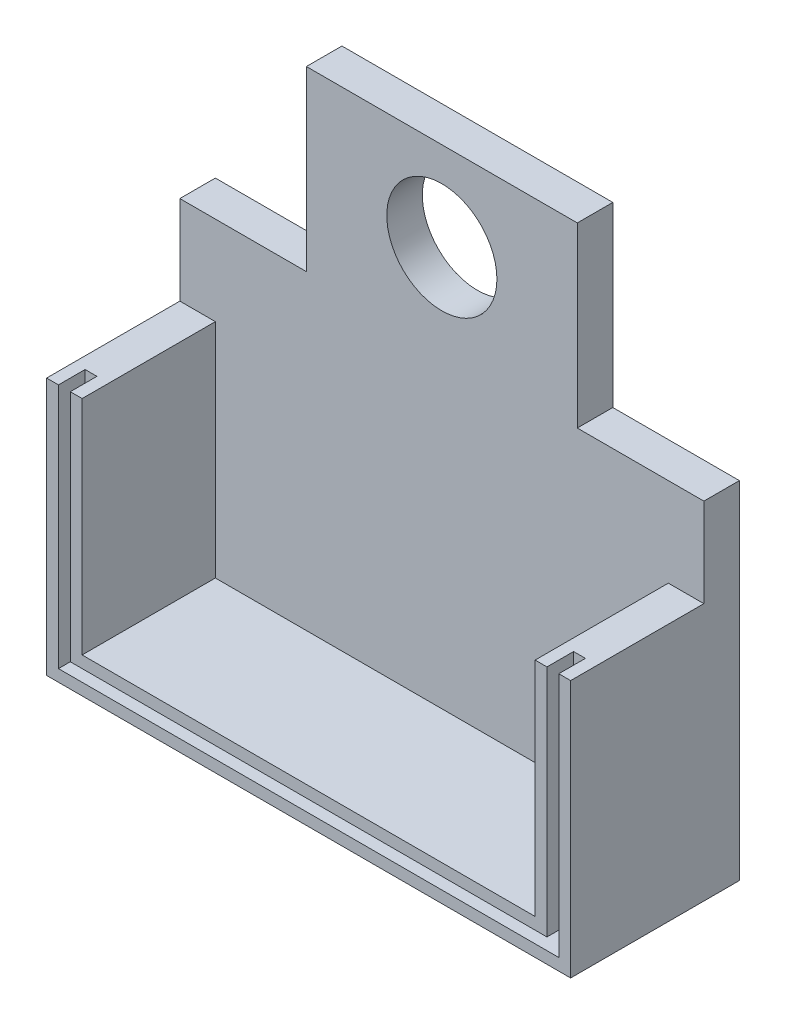
ISO-10303-21;
HEADER;
FILE_DESCRIPTION(('STEP AP214'),'2;1');
FILE_NAME('part.step','',(''),(''),'','','');
FILE_SCHEMA(('AUTOMOTIVE_DESIGN { 1 0 10303 214 1 1 1 1 }'));
ENDSEC;
DATA;
#1=APPLICATION_CONTEXT('core data for automotive mechanical design processes');
#2=APPLICATION_PROTOCOL_DEFINITION('international standard','automotive_design',2000,#1);
#3=PRODUCT_CONTEXT('',#1,'mechanical');
#4=PRODUCT('Part','Part','',(#3));
#5=PRODUCT_RELATED_PRODUCT_CATEGORY('part','',(#4));
#6=PRODUCT_DEFINITION_FORMATION('','',#4);
#7=PRODUCT_DEFINITION_CONTEXT('part definition',#1,'design');
#8=PRODUCT_DEFINITION('design','',#6,#7);
#9=PRODUCT_DEFINITION_SHAPE('','',#8);
#10=(LENGTH_UNIT() NAMED_UNIT(*) SI_UNIT(.MILLI.,.METRE.));
#11=(NAMED_UNIT(*) PLANE_ANGLE_UNIT() SI_UNIT($,.RADIAN.));
#12=(NAMED_UNIT(*) SI_UNIT($,.STERADIAN.) SOLID_ANGLE_UNIT());
#13=UNCERTAINTY_MEASURE_WITH_UNIT(LENGTH_MEASURE(1.E-05),#10,'distance_accuracy_value','');
#14=(GEOMETRIC_REPRESENTATION_CONTEXT(3) GLOBAL_UNCERTAINTY_ASSIGNED_CONTEXT((#13)) GLOBAL_UNIT_ASSIGNED_CONTEXT((#10,
#11,#12)) REPRESENTATION_CONTEXT('',''));
#15=CARTESIAN_POINT('',(0.,0.,0.));
#16=DIRECTION('',(0.,0.,1.));
#17=DIRECTION('',(1.,0.,0.));
#18=AXIS2_PLACEMENT_3D('',#15,#16,#17);
#19=CARTESIAN_POINT('',(0.,-20.,19.));
#20=DIRECTION('',(0.,-1.,0.));
#21=DIRECTION('',(0.,0.,-1.));
#22=AXIS2_PLACEMENT_3D('',#19,#20,#21);
#23=PLANE('',#22);
#24=DIRECTION('',(0.,0.,1.));
#25=VECTOR('',#24,1.);
#26=CARTESIAN_POINT('',(26.8333333333333,-20.,16.));
#27=LINE('',#26,#25);
#28=CARTESIAN_POINT('',(26.8333333333333,-20.,16.));
#29=VERTEX_POINT('',#28);
#30=CARTESIAN_POINT('',(26.8333333333333,-20.,19.));
#31=VERTEX_POINT('',#30);
#32=EDGE_CURVE('E270',#29,#31,#27,.T.);
#33=ORIENTED_EDGE('',*,*,#32,.F.);
#34=DIRECTION('',(-1.,0.,0.));
#35=VECTOR('',#34,1.);
#36=CARTESIAN_POINT('',(0.,-20.,16.));
#37=LINE('',#36,#35);
#38=CARTESIAN_POINT('',(28.1666666666667,-20.,16.));
#39=VERTEX_POINT('',#38);
#40=EDGE_CURVE('E235',#39,#29,#37,.T.);
#41=ORIENTED_EDGE('',*,*,#40,.F.);
#42=DIRECTION('',(0.,0.,1.));
#43=VECTOR('',#42,1.);
#44=CARTESIAN_POINT('',(28.1666666666667,-20.,16.));
#45=LINE('',#44,#43);
#46=CARTESIAN_POINT('',(28.1666666666667,-20.,19.));
#47=VERTEX_POINT('',#46);
#48=EDGE_CURVE('E273',#39,#47,#45,.T.);
#49=ORIENTED_EDGE('',*,*,#48,.T.);
#50=DIRECTION('',(-1.,0.,0.));
#51=VECTOR('',#50,1.);
#52=CARTESIAN_POINT('',(0.,-20.,19.));
#53=LINE('',#52,#51);
#54=CARTESIAN_POINT('',(29.5,-20.,19.));
#55=VERTEX_POINT('',#54);
#56=EDGE_CURVE('E297',#55,#47,#53,.T.);
#57=ORIENTED_EDGE('',*,*,#56,.F.);
#58=DIRECTION('',(0.,0.,-1.));
#59=VECTOR('',#58,1.);
#60=CARTESIAN_POINT('',(29.5,-20.,19.));
#61=LINE('',#60,#59);
#62=CARTESIAN_POINT('',(29.5,-20.,4.));
#63=VERTEX_POINT('',#62);
#64=EDGE_CURVE('E351',#55,#63,#61,.T.);
#65=ORIENTED_EDGE('',*,*,#64,.T.);
#66=DIRECTION('',(-1.,0.,0.));
#67=VECTOR('',#66,1.);
#68=CARTESIAN_POINT('',(0.,-20.,4.));
#69=LINE('',#68,#67);
#70=CARTESIAN_POINT('',(25.5,-20.,4.));
#71=VERTEX_POINT('',#70);
#72=EDGE_CURVE('E266',#63,#71,#69,.T.);
#73=ORIENTED_EDGE('',*,*,#72,.T.);
#74=DIRECTION('',(0.,0.,-1.));
#75=VECTOR('',#74,1.);
#76=CARTESIAN_POINT('',(25.5,-20.,19.));
#77=LINE('',#76,#75);
#78=CARTESIAN_POINT('',(25.5,-20.,19.));
#79=VERTEX_POINT('',#78);
#80=EDGE_CURVE('E347',#79,#71,#77,.T.);
#81=ORIENTED_EDGE('',*,*,#80,.F.);
#82=EDGE_CURVE('E296',#31,#79,#53,.T.);
#83=ORIENTED_EDGE('',*,*,#82,.F.);
#84=EDGE_LOOP('',(#33,#41,#49,#57,#65,#73,#81,#83));
#85=FACE_BOUND('',#84,.T.);
#86=ADVANCED_FACE('F45',(#85),#23,.F.);
#87=CARTESIAN_POINT('',(0.,-20.,19.));
#88=DIRECTION('',(0.,1.,0.));
#89=DIRECTION('',(0.,0.,1.));
#90=AXIS2_PLACEMENT_3D('',#87,#88,#89);
#91=PLANE('',#90);
#92=DIRECTION('',(-1.,0.,0.));
#93=VECTOR('',#92,1.);
#94=CARTESIAN_POINT('',(0.,-20.,16.));
#95=LINE('',#94,#93);
#96=CARTESIAN_POINT('',(-26.8333333333333,-20.,16.));
#97=VERTEX_POINT('',#96);
#98=CARTESIAN_POINT('',(-28.1666666666667,-20.,16.));
#99=VERTEX_POINT('',#98);
#100=EDGE_CURVE('E214',#97,#99,#95,.T.);
#101=ORIENTED_EDGE('',*,*,#100,.F.);
#102=DIRECTION('',(0.,0.,1.));
#103=VECTOR('',#102,1.);
#104=CARTESIAN_POINT('',(-26.8333333333333,-20.,16.));
#105=LINE('',#104,#103);
#106=CARTESIAN_POINT('',(-26.8333333333333,-20.,19.));
#107=VERTEX_POINT('',#106);
#108=EDGE_CURVE('E196',#97,#107,#105,.T.);
#109=ORIENTED_EDGE('',*,*,#108,.T.);
#110=DIRECTION('',(1.,0.,0.));
#111=VECTOR('',#110,1.);
#112=CARTESIAN_POINT('',(0.,-20.,19.));
#113=LINE('',#112,#111);
#114=CARTESIAN_POINT('',(-25.5,-20.,19.));
#115=VERTEX_POINT('',#114);
#116=EDGE_CURVE('E313',#107,#115,#113,.T.);
#117=ORIENTED_EDGE('',*,*,#116,.T.);
#118=DIRECTION('',(0.,0.,-1.));
#119=VECTOR('',#118,1.);
#120=CARTESIAN_POINT('',(-25.5,-20.,19.));
#121=LINE('',#120,#119);
#122=CARTESIAN_POINT('',(-25.5,-20.,4.));
#123=VERTEX_POINT('',#122);
#124=EDGE_CURVE('E336',#115,#123,#121,.T.);
#125=ORIENTED_EDGE('',*,*,#124,.T.);
#126=DIRECTION('',(1.,0.,0.));
#127=VECTOR('',#126,1.);
#128=CARTESIAN_POINT('',(0.,-20.,4.));
#129=LINE('',#128,#127);
#130=CARTESIAN_POINT('',(-29.5,-20.,4.));
#131=VERTEX_POINT('',#130);
#132=EDGE_CURVE('E69',#131,#123,#129,.T.);
#133=ORIENTED_EDGE('',*,*,#132,.F.);
#134=DIRECTION('',(0.,0.,-1.));
#135=VECTOR('',#134,1.);
#136=CARTESIAN_POINT('',(-29.5,-20.,19.));
#137=LINE('',#136,#135);
#138=CARTESIAN_POINT('',(-29.5,-20.,19.));
#139=VERTEX_POINT('',#138);
#140=EDGE_CURVE('E317',#139,#131,#137,.T.);
#141=ORIENTED_EDGE('',*,*,#140,.F.);
#142=CARTESIAN_POINT('',(-28.1666666666667,-20.,19.));
#143=VERTEX_POINT('',#142);
#144=EDGE_CURVE('E314',#139,#143,#113,.T.);
#145=ORIENTED_EDGE('',*,*,#144,.T.);
#146=DIRECTION('',(0.,0.,1.));
#147=VECTOR('',#146,1.);
#148=CARTESIAN_POINT('',(-28.1666666666667,-20.,16.));
#149=LINE('',#148,#147);
#150=EDGE_CURVE('E61',#99,#143,#149,.T.);
#151=ORIENTED_EDGE('',*,*,#150,.F.);
#152=EDGE_LOOP('',(#101,#109,#117,#125,#133,#141,#145,#151));
#153=FACE_BOUND('',#152,.T.);
#154=ADVANCED_FACE('F219',(#153),#91,.T.);
#155=CARTESIAN_POINT('',(0.,0.,19.));
#156=DIRECTION('',(0.,0.,1.));
#157=DIRECTION('',(1.,0.,0.));
#158=AXIS2_PLACEMENT_3D('',#155,#156,#157);
#159=PLANE('',#158);
#160=ORIENTED_EDGE('',*,*,#116,.F.);
#161=DIRECTION('',(0.,-1.,0.));
#162=VECTOR('',#161,1.);
#163=CARTESIAN_POINT('',(-26.8333333333333,0.,19.));
#164=LINE('',#163,#162);
#165=CARTESIAN_POINT('',(-26.8333333333333,-46.3333333333333,19.));
#166=VERTEX_POINT('',#165);
#167=EDGE_CURVE('E203',#107,#166,#164,.T.);
#168=ORIENTED_EDGE('',*,*,#167,.T.);
#169=DIRECTION('',(1.,0.,0.));
#170=VECTOR('',#169,1.);
#171=CARTESIAN_POINT('',(0.,-46.3333333333333,19.));
#172=LINE('',#171,#170);
#173=CARTESIAN_POINT('',(26.8333333333333,-46.3333333333333,19.));
#174=VERTEX_POINT('',#173);
#175=EDGE_CURVE('E217',#166,#174,#172,.T.);
#176=ORIENTED_EDGE('',*,*,#175,.T.);
#177=DIRECTION('',(0.,1.,0.));
#178=VECTOR('',#177,1.);
#179=CARTESIAN_POINT('',(26.8333333333333,0.,19.));
#180=LINE('',#179,#178);
#181=EDGE_CURVE('E256',#174,#31,#180,.T.);
#182=ORIENTED_EDGE('',*,*,#181,.T.);
#183=ORIENTED_EDGE('',*,*,#82,.T.);
#184=DIRECTION('',(0.,1.,0.));
#185=VECTOR('',#184,1.);
#186=CARTESIAN_POINT('',(25.5,0.,19.));
#187=LINE('',#186,#185);
#188=CARTESIAN_POINT('',(25.5,-45.,19.));
#189=VERTEX_POINT('',#188);
#190=EDGE_CURVE('E301',#189,#79,#187,.T.);
#191=ORIENTED_EDGE('',*,*,#190,.F.);
#192=DIRECTION('',(1.,0.,0.));
#193=VECTOR('',#192,1.);
#194=CARTESIAN_POINT('',(0.,-45.,19.));
#195=LINE('',#194,#193);
#196=CARTESIAN_POINT('',(-25.5,-45.,19.));
#197=VERTEX_POINT('',#196);
#198=EDGE_CURVE('E305',#197,#189,#195,.T.);
#199=ORIENTED_EDGE('',*,*,#198,.F.);
#200=DIRECTION('',(0.,1.,0.));
#201=VECTOR('',#200,1.);
#202=CARTESIAN_POINT('',(-25.5,0.,19.));
#203=LINE('',#202,#201);
#204=EDGE_CURVE('E309',#197,#115,#203,.T.);
#205=ORIENTED_EDGE('',*,*,#204,.T.);
#206=EDGE_LOOP('',(#160,#168,#176,#182,#183,#191,#199,#205));
#207=FACE_BOUND('',#206,.T.);
#208=ADVANCED_FACE('F458',(#207),#159,.T.);
#209=CARTESIAN_POINT('',(0.,0.,4.));
#210=DIRECTION('',(0.,0.,-1.));
#211=DIRECTION('',(-1.,0.,0.));
#212=AXIS2_PLACEMENT_3D('',#209,#210,#211);
#213=PLANE('',#212);
#214=DIRECTION('',(0.,1.,0.));
#215=VECTOR('',#214,1.);
#216=CARTESIAN_POINT('',(-29.5,-45.,4.));
#217=LINE('',#216,#215);
#218=CARTESIAN_POINT('',(-29.5,-10.,4.));
#219=VERTEX_POINT('',#218);
#220=EDGE_CURVE('E391',#131,#219,#217,.T.);
#221=ORIENTED_EDGE('',*,*,#220,.F.);
#222=ORIENTED_EDGE('',*,*,#132,.T.);
#223=DIRECTION('',(0.,1.,0.));
#224=VECTOR('',#223,1.);
#225=CARTESIAN_POINT('',(-25.5,0.,4.));
#226=LINE('',#225,#224);
#227=CARTESIAN_POINT('',(-25.5,-45.,4.));
#228=VERTEX_POINT('',#227);
#229=EDGE_CURVE('E327',#228,#123,#226,.T.);
#230=ORIENTED_EDGE('',*,*,#229,.F.);
#231=DIRECTION('',(1.,0.,0.));
#232=VECTOR('',#231,1.);
#233=CARTESIAN_POINT('',(0.,-45.,4.));
#234=LINE('',#233,#232);
#235=CARTESIAN_POINT('',(25.5,-45.,4.));
#236=VERTEX_POINT('',#235);
#237=EDGE_CURVE('E324',#228,#236,#234,.T.);
#238=ORIENTED_EDGE('',*,*,#237,.T.);
#239=DIRECTION('',(0.,1.,0.));
#240=VECTOR('',#239,1.);
#241=CARTESIAN_POINT('',(25.5,0.,4.));
#242=LINE('',#241,#240);
#243=EDGE_CURVE('E321',#236,#71,#242,.T.);
#244=ORIENTED_EDGE('',*,*,#243,.T.);
#245=ORIENTED_EDGE('',*,*,#72,.F.);
#246=DIRECTION('',(0.,1.,0.));
#247=VECTOR('',#246,1.);
#248=CARTESIAN_POINT('',(29.5,-45.,4.));
#249=LINE('',#248,#247);
#250=CARTESIAN_POINT('',(29.5,-10.,4.));
#251=VERTEX_POINT('',#250);
#252=EDGE_CURVE('E394',#63,#251,#249,.T.);
#253=ORIENTED_EDGE('',*,*,#252,.T.);
#254=DIRECTION('',(-1.,0.,0.));
#255=VECTOR('',#254,1.);
#256=CARTESIAN_POINT('',(-29.5,-10.,4.));
#257=LINE('',#256,#255);
#258=CARTESIAN_POINT('',(15.25,-10.,4.));
#259=VERTEX_POINT('',#258);
#260=EDGE_CURVE('E371',#251,#259,#257,.T.);
#261=ORIENTED_EDGE('',*,*,#260,.T.);
#262=DIRECTION('',(0.,1.,0.));
#263=VECTOR('',#262,1.);
#264=CARTESIAN_POINT('',(15.25,-10.,4.));
#265=LINE('',#264,#263);
#266=CARTESIAN_POINT('',(15.25,10.,4.));
#267=VERTEX_POINT('',#266);
#268=EDGE_CURVE('E406',#259,#267,#265,.T.);
#269=ORIENTED_EDGE('',*,*,#268,.T.);
#270=DIRECTION('',(-1.,0.,0.));
#271=VECTOR('',#270,1.);
#272=CARTESIAN_POINT('',(-15.25,10.,4.));
#273=LINE('',#272,#271);
#274=CARTESIAN_POINT('',(-15.25,10.,4.));
#275=VERTEX_POINT('',#274);
#276=EDGE_CURVE('E410',#267,#275,#273,.T.);
#277=ORIENTED_EDGE('',*,*,#276,.T.);
#278=DIRECTION('',(0.,-1.,0.));
#279=VECTOR('',#278,1.);
#280=CARTESIAN_POINT('',(-15.25,-10.,4.));
#281=LINE('',#280,#279);
#282=CARTESIAN_POINT('',(-15.25,-10.,4.));
#283=VERTEX_POINT('',#282);
#284=EDGE_CURVE('E414',#275,#283,#281,.T.);
#285=ORIENTED_EDGE('',*,*,#284,.T.);
#286=EDGE_CURVE('E370',#283,#219,#257,.T.);
#287=ORIENTED_EDGE('',*,*,#286,.T.);
#288=EDGE_LOOP('',(#221,#222,#230,#238,#244,#245,#253,#261,#269,#277,#285,#287));
#289=FACE_BOUND('',#288,.T.);
#290=CARTESIAN_POINT('',(0.,0.,4.));
#291=DIRECTION('',(0.,0.,1.));
#292=DIRECTION('',(1.,0.,0.));
#293=AXIS2_PLACEMENT_3D('',#290,#291,#292);
#294=CIRCLE('',#293,6.2);
#295=CARTESIAN_POINT('',(6.2,0.,4.));
#296=VERTEX_POINT('',#295);
#297=EDGE_CURVE('E398',#296,#296,#294,.T.);
#298=ORIENTED_EDGE('',*,*,#297,.F.);
#299=EDGE_LOOP('',(#298));
#300=FACE_BOUND('',#299,.T.);
#301=ADVANCED_FACE('F532',(#289,#300),#213,.F.);
#302=CARTESIAN_POINT('',(0.,0.,0.));
#303=DIRECTION('',(0.,0.,-1.));
#304=DIRECTION('',(-1.,0.,0.));
#305=AXIS2_PLACEMENT_3D('',#302,#303,#304);
#306=PLANE('',#305);
#307=DIRECTION('',(0.,1.,0.));
#308=VECTOR('',#307,1.);
#309=CARTESIAN_POINT('',(15.25,-10.,0.));
#310=LINE('',#309,#308);
#311=CARTESIAN_POINT('',(15.25,-10.,0.));
#312=VERTEX_POINT('',#311);
#313=CARTESIAN_POINT('',(15.25,10.,0.));
#314=VERTEX_POINT('',#313);
#315=EDGE_CURVE('E402',#312,#314,#310,.T.);
#316=ORIENTED_EDGE('',*,*,#315,.F.);
#317=DIRECTION('',(1.,0.,0.));
#318=VECTOR('',#317,1.);
#319=CARTESIAN_POINT('',(-29.5,-10.,0.));
#320=LINE('',#319,#318);
#321=CARTESIAN_POINT('',(29.5,-10.,0.));
#322=VERTEX_POINT('',#321);
#323=EDGE_CURVE('E378',#312,#322,#320,.T.);
#324=ORIENTED_EDGE('',*,*,#323,.T.);
#325=DIRECTION('',(0.,1.,0.));
#326=VECTOR('',#325,1.);
#327=CARTESIAN_POINT('',(29.5,-45.,0.));
#328=LINE('',#327,#326);
#329=CARTESIAN_POINT('',(29.5,-49.,0.));
#330=VERTEX_POINT('',#329);
#331=EDGE_CURVE('E383',#330,#322,#328,.T.);
#332=ORIENTED_EDGE('',*,*,#331,.F.);
#333=DIRECTION('',(1.,0.,0.));
#334=VECTOR('',#333,1.);
#335=CARTESIAN_POINT('',(-29.5,-49.,0.));
#336=LINE('',#335,#334);
#337=CARTESIAN_POINT('',(-29.5,-49.,0.));
#338=VERTEX_POINT('',#337);
#339=EDGE_CURVE('E359',#338,#330,#336,.T.);
#340=ORIENTED_EDGE('',*,*,#339,.F.);
#341=DIRECTION('',(0.,1.,0.));
#342=VECTOR('',#341,1.);
#343=CARTESIAN_POINT('',(-29.5,-45.,0.));
#344=LINE('',#343,#342);
#345=CARTESIAN_POINT('',(-29.5,-10.,0.));
#346=VERTEX_POINT('',#345);
#347=EDGE_CURVE('E387',#338,#346,#344,.T.);
#348=ORIENTED_EDGE('',*,*,#347,.T.);
#349=CARTESIAN_POINT('',(-15.25,-10.,0.));
#350=VERTEX_POINT('',#349);
#351=EDGE_CURVE('E379',#346,#350,#320,.T.);
#352=ORIENTED_EDGE('',*,*,#351,.T.);
#353=DIRECTION('',(0.,-1.,0.));
#354=VECTOR('',#353,1.);
#355=CARTESIAN_POINT('',(-15.25,-10.,0.));
#356=LINE('',#355,#354);
#357=CARTESIAN_POINT('',(-15.25,10.,0.));
#358=VERTEX_POINT('',#357);
#359=EDGE_CURVE('E411',#358,#350,#356,.T.);
#360=ORIENTED_EDGE('',*,*,#359,.F.);
#361=DIRECTION('',(-1.,0.,0.));
#362=VECTOR('',#361,1.);
#363=CARTESIAN_POINT('',(-15.25,10.,0.));
#364=LINE('',#363,#362);
#365=EDGE_CURVE('E421',#314,#358,#364,.T.);
#366=ORIENTED_EDGE('',*,*,#365,.F.);
#367=EDGE_LOOP('',(#316,#324,#332,#340,#348,#352,#360,#366));
#368=FACE_BOUND('',#367,.T.);
#369=CARTESIAN_POINT('',(0.,0.,0.));
#370=DIRECTION('',(0.,0.,1.));
#371=DIRECTION('',(1.,0.,0.));
#372=AXIS2_PLACEMENT_3D('',#369,#370,#371);
#373=CIRCLE('',#372,6.2);
#374=CARTESIAN_POINT('',(6.2,0.,0.));
#375=VERTEX_POINT('',#374);
#376=EDGE_CURVE('E397',#375,#375,#373,.T.);
#377=ORIENTED_EDGE('',*,*,#376,.T.);
#378=EDGE_LOOP('',(#377));
#379=FACE_BOUND('',#378,.T.);
#380=ADVANCED_FACE('F442',(#368,#379),#306,.T.);
#381=CARTESIAN_POINT('',(15.25,-10.,4.));
#382=DIRECTION('',(-1.,0.,0.));
#383=DIRECTION('',(0.,0.,1.));
#384=AXIS2_PLACEMENT_3D('',#381,#382,#383);
#385=PLANE('',#384);
#386=ORIENTED_EDGE('',*,*,#315,.T.);
#387=DIRECTION('',(0.,0.,-1.));
#388=VECTOR('',#387,1.);
#389=CARTESIAN_POINT('',(15.25,10.,4.));
#390=LINE('',#389,#388);
#391=EDGE_CURVE('E11',#267,#314,#390,.T.);
#392=ORIENTED_EDGE('',*,*,#391,.F.);
#393=ORIENTED_EDGE('',*,*,#268,.F.);
#394=DIRECTION('',(0.,0.,-1.));
#395=VECTOR('',#394,1.);
#396=CARTESIAN_POINT('',(15.25,-10.,4.));
#397=LINE('',#396,#395);
#398=EDGE_CURVE('E417',#259,#312,#397,.T.);
#399=ORIENTED_EDGE('',*,*,#398,.T.);
#400=EDGE_LOOP('',(#386,#392,#393,#399));
#401=FACE_BOUND('',#400,.T.);
#402=ADVANCED_FACE('F47',(#401),#385,.F.);
#403=CARTESIAN_POINT('',(-15.25,10.,4.));
#404=DIRECTION('',(0.,-1.,0.));
#405=DIRECTION('',(0.,0.,-1.));
#406=AXIS2_PLACEMENT_3D('',#403,#404,#405);
#407=PLANE('',#406);
#408=ORIENTED_EDGE('',*,*,#365,.T.);
#409=DIRECTION('',(0.,0.,-1.));
#410=VECTOR('',#409,1.);
#411=CARTESIAN_POINT('',(-15.25,10.,4.));
#412=LINE('',#411,#410);
#413=EDGE_CURVE('E54',#275,#358,#412,.T.);
#414=ORIENTED_EDGE('',*,*,#413,.F.);
#415=ORIENTED_EDGE('',*,*,#276,.F.);
#416=ORIENTED_EDGE('',*,*,#391,.T.);
#417=EDGE_LOOP('',(#408,#414,#415,#416));
#418=FACE_BOUND('',#417,.T.);
#419=ADVANCED_FACE('F537',(#418),#407,.F.);
#420=CARTESIAN_POINT('',(-15.25,-10.,4.));
#421=DIRECTION('',(1.,0.,0.));
#422=DIRECTION('',(0.,0.,-1.));
#423=AXIS2_PLACEMENT_3D('',#420,#421,#422);
#424=PLANE('',#423);
#425=ORIENTED_EDGE('',*,*,#359,.T.);
#426=DIRECTION('',(0.,0.,-1.));
#427=VECTOR('',#426,1.);
#428=CARTESIAN_POINT('',(-15.25,-10.,4.));
#429=LINE('',#428,#427);
#430=EDGE_CURVE('E428',#283,#350,#429,.T.);
#431=ORIENTED_EDGE('',*,*,#430,.F.);
#432=ORIENTED_EDGE('',*,*,#284,.F.);
#433=ORIENTED_EDGE('',*,*,#413,.T.);
#434=EDGE_LOOP('',(#425,#431,#432,#433));
#435=FACE_BOUND('',#434,.T.);
#436=ADVANCED_FACE('F437',(#435),#424,.F.);
#437=CARTESIAN_POINT('',(0.,0.,4.));
#438=DIRECTION('',(0.,0.,-1.));
#439=DIRECTION('',(-1.,0.,0.));
#440=AXIS2_PLACEMENT_3D('',#437,#438,#439);
#441=CYLINDRICAL_SURFACE('',#440,6.2);
#442=ORIENTED_EDGE('',*,*,#297,.T.);
#443=EDGE_LOOP('',(#442));
#444=FACE_BOUND('',#443,.T.);
#445=ORIENTED_EDGE('',*,*,#376,.F.);
#446=EDGE_LOOP('',(#445));
#447=FACE_BOUND('',#446,.T.);
#448=ADVANCED_FACE('F528',(#444,#447),#441,.F.);
#449=CARTESIAN_POINT('',(0.,-10.,0.));
#450=DIRECTION('',(0.,1.,0.));
#451=DIRECTION('',(0.,0.,1.));
#452=AXIS2_PLACEMENT_3D('',#449,#450,#451);
#453=PLANE('',#452);
#454=ORIENTED_EDGE('',*,*,#398,.F.);
#455=ORIENTED_EDGE('',*,*,#260,.F.);
#456=DIRECTION('',(0.,0.,1.));
#457=VECTOR('',#456,1.);
#458=CARTESIAN_POINT('',(29.5,-10.,0.));
#459=LINE('',#458,#457);
#460=EDGE_CURVE('E366',#322,#251,#459,.T.);
#461=ORIENTED_EDGE('',*,*,#460,.F.);
#462=ORIENTED_EDGE('',*,*,#323,.F.);
#463=EDGE_LOOP('',(#454,#455,#461,#462));
#464=FACE_BOUND('',#463,.T.);
#465=ADVANCED_FACE('F521',(#464),#453,.T.);
#466=CARTESIAN_POINT('',(29.5,-45.,0.));
#467=DIRECTION('',(-1.,0.,0.));
#468=DIRECTION('',(0.,0.,1.));
#469=AXIS2_PLACEMENT_3D('',#466,#467,#468);
#470=PLANE('',#469);
#471=ORIENTED_EDGE('',*,*,#460,.T.);
#472=ORIENTED_EDGE('',*,*,#252,.F.);
#473=ORIENTED_EDGE('',*,*,#64,.F.);
#474=DIRECTION('',(0.,1.,0.));
#475=VECTOR('',#474,1.);
#476=CARTESIAN_POINT('',(29.5,0.,19.));
#477=LINE('',#476,#475);
#478=CARTESIAN_POINT('',(29.5,-49.,19.));
#479=VERTEX_POINT('',#478);
#480=EDGE_CURVE('E293',#479,#55,#477,.T.);
#481=ORIENTED_EDGE('',*,*,#480,.F.);
#482=DIRECTION('',(0.,0.,1.));
#483=VECTOR('',#482,1.);
#484=CARTESIAN_POINT('',(29.5,-49.,4.));
#485=LINE('',#484,#483);
#486=EDGE_CURVE('E363',#330,#479,#485,.T.);
#487=ORIENTED_EDGE('',*,*,#486,.F.);
#488=ORIENTED_EDGE('',*,*,#331,.T.);
#489=EDGE_LOOP('',(#471,#472,#473,#481,#487,#488));
#490=FACE_BOUND('',#489,.T.);
#491=ADVANCED_FACE('F524',(#490),#470,.F.);
#492=CARTESIAN_POINT('',(-29.5,-45.,0.));
#493=DIRECTION('',(1.,0.,0.));
#494=DIRECTION('',(0.,0.,-1.));
#495=AXIS2_PLACEMENT_3D('',#492,#493,#494);
#496=PLANE('',#495);
#497=DIRECTION('',(0.,0.,-1.));
#498=VECTOR('',#497,1.);
#499=CARTESIAN_POINT('',(-29.5,-10.,0.));
#500=LINE('',#499,#498);
#501=EDGE_CURVE('E375',#219,#346,#500,.T.);
#502=ORIENTED_EDGE('',*,*,#501,.T.);
#503=ORIENTED_EDGE('',*,*,#347,.F.);
#504=DIRECTION('',(0.,0.,-1.));
#505=VECTOR('',#504,1.);
#506=CARTESIAN_POINT('',(-29.5,-49.,4.));
#507=LINE('',#506,#505);
#508=CARTESIAN_POINT('',(-29.5,-49.,19.));
#509=VERTEX_POINT('',#508);
#510=EDGE_CURVE('E355',#509,#338,#507,.T.);
#511=ORIENTED_EDGE('',*,*,#510,.F.);
#512=DIRECTION('',(0.,-1.,0.));
#513=VECTOR('',#512,1.);
#514=CARTESIAN_POINT('',(-29.5,0.,19.));
#515=LINE('',#514,#513);
#516=EDGE_CURVE('E285',#139,#509,#515,.T.);
#517=ORIENTED_EDGE('',*,*,#516,.F.);
#518=ORIENTED_EDGE('',*,*,#140,.T.);
#519=ORIENTED_EDGE('',*,*,#220,.T.);
#520=EDGE_LOOP('',(#502,#503,#511,#517,#518,#519));
#521=FACE_BOUND('',#520,.T.);
#522=ADVANCED_FACE('F476',(#521),#496,.F.);
#523=ORIENTED_EDGE('',*,*,#286,.F.);
#524=ORIENTED_EDGE('',*,*,#430,.T.);
#525=ORIENTED_EDGE('',*,*,#351,.F.);
#526=ORIENTED_EDGE('',*,*,#501,.F.);
#527=EDGE_LOOP('',(#523,#524,#525,#526));
#528=FACE_BOUND('',#527,.T.);
#529=ADVANCED_FACE('F449',(#528),#453,.T.);
#530=CARTESIAN_POINT('',(0.,-49.,0.));
#531=DIRECTION('',(0.,-1.,0.));
#532=DIRECTION('',(0.,0.,-1.));
#533=AXIS2_PLACEMENT_3D('',#530,#531,#532);
#534=PLANE('',#533);
#535=ORIENTED_EDGE('',*,*,#510,.T.);
#536=ORIENTED_EDGE('',*,*,#339,.T.);
#537=ORIENTED_EDGE('',*,*,#486,.T.);
#538=DIRECTION('',(1.,0.,0.));
#539=VECTOR('',#538,1.);
#540=CARTESIAN_POINT('',(0.,-49.,19.));
#541=LINE('',#540,#539);
#542=EDGE_CURVE('E289',#509,#479,#541,.T.);
#543=ORIENTED_EDGE('',*,*,#542,.F.);
#544=EDGE_LOOP('',(#535,#536,#537,#543));
#545=FACE_BOUND('',#544,.T.);
#546=ADVANCED_FACE('F515',(#545),#534,.T.);
#547=CARTESIAN_POINT('',(25.5,0.,19.));
#548=DIRECTION('',(-1.,0.,0.));
#549=DIRECTION('',(0.,0.,1.));
#550=AXIS2_PLACEMENT_3D('',#547,#548,#549);
#551=PLANE('',#550);
#552=ORIENTED_EDGE('',*,*,#243,.F.);
#553=DIRECTION('',(0.,0.,-1.));
#554=VECTOR('',#553,1.);
#555=CARTESIAN_POINT('',(25.5,-45.,19.));
#556=LINE('',#555,#554);
#557=EDGE_CURVE('E343',#189,#236,#556,.T.);
#558=ORIENTED_EDGE('',*,*,#557,.F.);
#559=ORIENTED_EDGE('',*,*,#190,.T.);
#560=ORIENTED_EDGE('',*,*,#80,.T.);
#561=EDGE_LOOP('',(#552,#558,#559,#560));
#562=FACE_BOUND('',#561,.T.);
#563=ADVANCED_FACE('F465',(#562),#551,.T.);
#564=CARTESIAN_POINT('',(0.,-45.,19.));
#565=DIRECTION('',(0.,1.,0.));
#566=DIRECTION('',(0.,0.,1.));
#567=AXIS2_PLACEMENT_3D('',#564,#565,#566);
#568=PLANE('',#567);
#569=ORIENTED_EDGE('',*,*,#237,.F.);
#570=DIRECTION('',(0.,0.,-1.));
#571=VECTOR('',#570,1.);
#572=CARTESIAN_POINT('',(-25.5,-45.,19.));
#573=LINE('',#572,#571);
#574=EDGE_CURVE('E339',#197,#228,#573,.T.);
#575=ORIENTED_EDGE('',*,*,#574,.F.);
#576=ORIENTED_EDGE('',*,*,#198,.T.);
#577=ORIENTED_EDGE('',*,*,#557,.T.);
#578=EDGE_LOOP('',(#569,#575,#576,#577));
#579=FACE_BOUND('',#578,.T.);
#580=ADVANCED_FACE('F468',(#579),#568,.T.);
#581=CARTESIAN_POINT('',(-25.5,0.,19.));
#582=DIRECTION('',(-1.,0.,0.));
#583=DIRECTION('',(0.,0.,1.));
#584=AXIS2_PLACEMENT_3D('',#581,#582,#583);
#585=PLANE('',#584);
#586=ORIENTED_EDGE('',*,*,#229,.T.);
#587=ORIENTED_EDGE('',*,*,#124,.F.);
#588=ORIENTED_EDGE('',*,*,#204,.F.);
#589=ORIENTED_EDGE('',*,*,#574,.T.);
#590=EDGE_LOOP('',(#586,#587,#588,#589));
#591=FACE_BOUND('',#590,.T.);
#592=ADVANCED_FACE('F472',(#591),#585,.F.);
#593=DIRECTION('',(0.,1.,0.));
#594=VECTOR('',#593,1.);
#595=CARTESIAN_POINT('',(28.1666666666667,0.,19.));
#596=LINE('',#595,#594);
#597=CARTESIAN_POINT('',(28.1666666666667,-47.6666666666667,19.));
#598=VERTEX_POINT('',#597);
#599=EDGE_CURVE('E253',#598,#47,#596,.T.);
#600=ORIENTED_EDGE('',*,*,#599,.F.);
#601=DIRECTION('',(1.,0.,0.));
#602=VECTOR('',#601,1.);
#603=CARTESIAN_POINT('',(0.,-47.6666666666667,19.));
#604=LINE('',#603,#602);
#605=CARTESIAN_POINT('',(-28.1666666666667,-47.6666666666667,19.));
#606=VERTEX_POINT('',#605);
#607=EDGE_CURVE('E249',#606,#598,#604,.T.);
#608=ORIENTED_EDGE('',*,*,#607,.F.);
#609=DIRECTION('',(0.,-1.,0.));
#610=VECTOR('',#609,1.);
#611=CARTESIAN_POINT('',(-28.1666666666667,0.,19.));
#612=LINE('',#611,#610);
#613=EDGE_CURVE('E246',#143,#606,#612,.T.);
#614=ORIENTED_EDGE('',*,*,#613,.F.);
#615=ORIENTED_EDGE('',*,*,#144,.F.);
#616=ORIENTED_EDGE('',*,*,#516,.T.);
#617=ORIENTED_EDGE('',*,*,#542,.T.);
#618=ORIENTED_EDGE('',*,*,#480,.T.);
#619=ORIENTED_EDGE('',*,*,#56,.T.);
#620=EDGE_LOOP('',(#600,#608,#614,#615,#616,#617,#618,#619));
#621=FACE_BOUND('',#620,.T.);
#622=ADVANCED_FACE('F480',(#621),#159,.T.);
#623=CARTESIAN_POINT('',(-26.8333333333333,0.,16.));
#624=DIRECTION('',(-1.,0.,0.));
#625=DIRECTION('',(0.,-1.,0.));
#626=AXIS2_PLACEMENT_3D('',#623,#624,#625);
#627=PLANE('',#626);
#628=ORIENTED_EDGE('',*,*,#167,.F.);
#629=ORIENTED_EDGE('',*,*,#108,.F.);
#630=DIRECTION('',(0.,-1.,0.));
#631=VECTOR('',#630,1.);
#632=CARTESIAN_POINT('',(-26.8333333333333,0.,16.));
#633=LINE('',#632,#631);
#634=CARTESIAN_POINT('',(-26.8333333333333,-46.3333333333333,16.));
#635=VERTEX_POINT('',#634);
#636=EDGE_CURVE('E200',#97,#635,#633,.T.);
#637=ORIENTED_EDGE('',*,*,#636,.T.);
#638=DIRECTION('',(0.,0.,1.));
#639=VECTOR('',#638,1.);
#640=CARTESIAN_POINT('',(-26.8333333333333,-46.3333333333333,16.));
#641=LINE('',#640,#639);
#642=EDGE_CURVE('E263',#635,#166,#641,.T.);
#643=ORIENTED_EDGE('',*,*,#642,.T.);
#644=EDGE_LOOP('',(#628,#629,#637,#643));
#645=FACE_BOUND('',#644,.T.);
#646=ADVANCED_FACE('F198',(#645),#627,.T.);
#647=CARTESIAN_POINT('',(0.,-46.3333333333333,16.));
#648=DIRECTION('',(0.,-1.,0.));
#649=DIRECTION('',(0.,0.,-1.));
#650=AXIS2_PLACEMENT_3D('',#647,#648,#649);
#651=PLANE('',#650);
#652=ORIENTED_EDGE('',*,*,#175,.F.);
#653=ORIENTED_EDGE('',*,*,#642,.F.);
#654=DIRECTION('',(1.,0.,0.));
#655=VECTOR('',#654,1.);
#656=CARTESIAN_POINT('',(0.,-46.3333333333333,16.));
#657=LINE('',#656,#655);
#658=CARTESIAN_POINT('',(26.8333333333333,-46.3333333333333,16.));
#659=VERTEX_POINT('',#658);
#660=EDGE_CURVE('E208',#635,#659,#657,.T.);
#661=ORIENTED_EDGE('',*,*,#660,.T.);
#662=DIRECTION('',(0.,0.,1.));
#663=VECTOR('',#662,1.);
#664=CARTESIAN_POINT('',(26.8333333333333,-46.3333333333333,16.));
#665=LINE('',#664,#663);
#666=EDGE_CURVE('E267',#659,#174,#665,.T.);
#667=ORIENTED_EDGE('',*,*,#666,.T.);
#668=EDGE_LOOP('',(#652,#653,#661,#667));
#669=FACE_BOUND('',#668,.T.);
#670=ADVANCED_FACE('F494',(#669),#651,.T.);
#671=CARTESIAN_POINT('',(26.8333333333333,0.,16.));
#672=DIRECTION('',(1.,0.,0.));
#673=DIRECTION('',(0.,0.,-1.));
#674=AXIS2_PLACEMENT_3D('',#671,#672,#673);
#675=PLANE('',#674);
#676=ORIENTED_EDGE('',*,*,#181,.F.);
#677=ORIENTED_EDGE('',*,*,#666,.F.);
#678=DIRECTION('',(0.,1.,0.));
#679=VECTOR('',#678,1.);
#680=CARTESIAN_POINT('',(26.8333333333333,0.,16.));
#681=LINE('',#680,#679);
#682=EDGE_CURVE('E239',#659,#29,#681,.T.);
#683=ORIENTED_EDGE('',*,*,#682,.T.);
#684=ORIENTED_EDGE('',*,*,#32,.T.);
#685=EDGE_LOOP('',(#676,#677,#683,#684));
#686=FACE_BOUND('',#685,.T.);
#687=ADVANCED_FACE('F491',(#686),#675,.T.);
#688=CARTESIAN_POINT('',(28.1666666666667,0.,16.));
#689=DIRECTION('',(1.,0.,0.));
#690=DIRECTION('',(0.,0.,-1.));
#691=AXIS2_PLACEMENT_3D('',#688,#689,#690);
#692=PLANE('',#691);
#693=ORIENTED_EDGE('',*,*,#599,.T.);
#694=ORIENTED_EDGE('',*,*,#48,.F.);
#695=DIRECTION('',(0.,1.,0.));
#696=VECTOR('',#695,1.);
#697=CARTESIAN_POINT('',(28.1666666666667,0.,16.));
#698=LINE('',#697,#696);
#699=CARTESIAN_POINT('',(28.1666666666667,-47.6666666666667,16.));
#700=VERTEX_POINT('',#699);
#701=EDGE_CURVE('E231',#700,#39,#698,.T.);
#702=ORIENTED_EDGE('',*,*,#701,.F.);
#703=DIRECTION('',(0.,0.,1.));
#704=VECTOR('',#703,1.);
#705=CARTESIAN_POINT('',(28.1666666666667,-47.6666666666667,16.));
#706=LINE('',#705,#704);
#707=EDGE_CURVE('E277',#700,#598,#706,.T.);
#708=ORIENTED_EDGE('',*,*,#707,.T.);
#709=EDGE_LOOP('',(#693,#694,#702,#708));
#710=FACE_BOUND('',#709,.T.);
#711=ADVANCED_FACE('F501',(#710),#692,.F.);
#712=CARTESIAN_POINT('',(0.,-47.6666666666667,16.));
#713=DIRECTION('',(0.,-1.,0.));
#714=DIRECTION('',(0.,0.,-1.));
#715=AXIS2_PLACEMENT_3D('',#712,#713,#714);
#716=PLANE('',#715);
#717=ORIENTED_EDGE('',*,*,#607,.T.);
#718=ORIENTED_EDGE('',*,*,#707,.F.);
#719=DIRECTION('',(1.,0.,0.));
#720=VECTOR('',#719,1.);
#721=CARTESIAN_POINT('',(0.,-47.6666666666667,16.));
#722=LINE('',#721,#720);
#723=CARTESIAN_POINT('',(-28.1666666666667,-47.6666666666667,16.));
#724=VERTEX_POINT('',#723);
#725=EDGE_CURVE('E225',#724,#700,#722,.T.);
#726=ORIENTED_EDGE('',*,*,#725,.F.);
#727=DIRECTION('',(0.,0.,1.));
#728=VECTOR('',#727,1.);
#729=CARTESIAN_POINT('',(-28.1666666666667,-47.6666666666667,16.));
#730=LINE('',#729,#728);
#731=EDGE_CURVE('E280',#724,#606,#730,.T.);
#732=ORIENTED_EDGE('',*,*,#731,.T.);
#733=EDGE_LOOP('',(#717,#718,#726,#732));
#734=FACE_BOUND('',#733,.T.);
#735=ADVANCED_FACE('F485',(#734),#716,.F.);
#736=CARTESIAN_POINT('',(-28.1666666666667,0.,16.));
#737=DIRECTION('',(-1.,0.,0.));
#738=DIRECTION('',(0.,-1.,0.));
#739=AXIS2_PLACEMENT_3D('',#736,#737,#738);
#740=PLANE('',#739);
#741=ORIENTED_EDGE('',*,*,#613,.T.);
#742=ORIENTED_EDGE('',*,*,#731,.F.);
#743=DIRECTION('',(0.,-1.,0.));
#744=VECTOR('',#743,1.);
#745=CARTESIAN_POINT('',(-28.1666666666667,0.,16.));
#746=LINE('',#745,#744);
#747=EDGE_CURVE('E222',#99,#724,#746,.T.);
#748=ORIENTED_EDGE('',*,*,#747,.F.);
#749=ORIENTED_EDGE('',*,*,#150,.T.);
#750=EDGE_LOOP('',(#741,#742,#748,#749));
#751=FACE_BOUND('',#750,.T.);
#752=ADVANCED_FACE('F482',(#751),#740,.F.);
#753=CARTESIAN_POINT('',(0.,0.,16.));
#754=DIRECTION('',(0.,0.,1.));
#755=DIRECTION('',(1.,0.,0.));
#756=AXIS2_PLACEMENT_3D('',#753,#754,#755);
#757=PLANE('',#756);
#758=ORIENTED_EDGE('',*,*,#636,.F.);
#759=ORIENTED_EDGE('',*,*,#100,.T.);
#760=ORIENTED_EDGE('',*,*,#747,.T.);
#761=ORIENTED_EDGE('',*,*,#725,.T.);
#762=ORIENTED_EDGE('',*,*,#701,.T.);
#763=ORIENTED_EDGE('',*,*,#40,.T.);
#764=ORIENTED_EDGE('',*,*,#682,.F.);
#765=ORIENTED_EDGE('',*,*,#660,.F.);
#766=EDGE_LOOP('',(#758,#759,#760,#761,#762,#763,#764,#765));
#767=FACE_BOUND('',#766,.T.);
#768=ADVANCED_FACE('F212',(#767),#757,.T.);
#769=CLOSED_SHELL('',(#86,#154,#208,#301,#380,#402,#419,#436,#448,#465,#491,#522,#529,#546,#563,
#580,#592,#622,#646,#670,#687,#711,#735,#752,#768));
#770=MANIFOLD_SOLID_BREP('B2',#769);
#771=ADVANCED_BREP_SHAPE_REPRESENTATION('',(#18,#770),#14);
#772=SHAPE_DEFINITION_REPRESENTATION(#9,#771);
ENDSEC;
END-ISO-10303-21;
